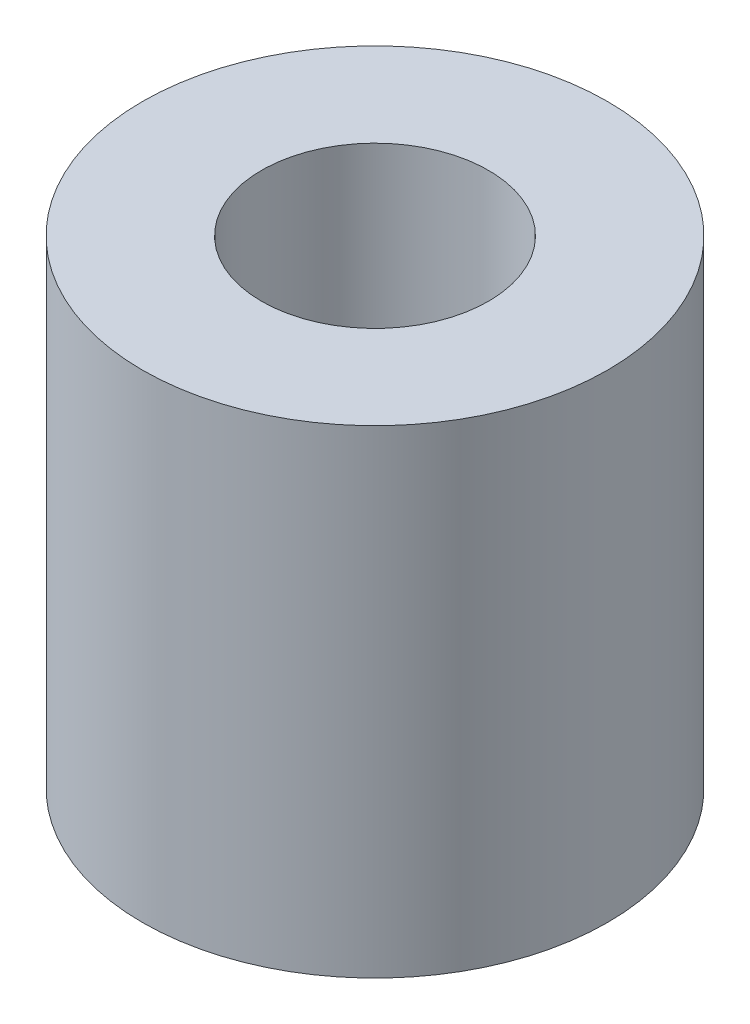
ISO-10303-21;
HEADER;
FILE_DESCRIPTION(('STEP AP214'),'2;1');
FILE_NAME('part.step','',(''),(''),'','','');
FILE_SCHEMA(('AUTOMOTIVE_DESIGN { 1 0 10303 214 1 1 1 1 }'));
ENDSEC;
DATA;
#1=APPLICATION_CONTEXT('core data for automotive mechanical design processes');
#2=APPLICATION_PROTOCOL_DEFINITION('international standard','automotive_design',2000,#1);
#3=PRODUCT_CONTEXT('',#1,'mechanical');
#4=PRODUCT('Part','Part','',(#3));
#5=PRODUCT_RELATED_PRODUCT_CATEGORY('part','',(#4));
#6=PRODUCT_DEFINITION_FORMATION('','',#4);
#7=PRODUCT_DEFINITION_CONTEXT('part definition',#1,'design');
#8=PRODUCT_DEFINITION('design','',#6,#7);
#9=PRODUCT_DEFINITION_SHAPE('','',#8);
#10=(LENGTH_UNIT() NAMED_UNIT(*) SI_UNIT(.MILLI.,.METRE.));
#11=(NAMED_UNIT(*) PLANE_ANGLE_UNIT() SI_UNIT($,.RADIAN.));
#12=(NAMED_UNIT(*) SI_UNIT($,.STERADIAN.) SOLID_ANGLE_UNIT());
#13=UNCERTAINTY_MEASURE_WITH_UNIT(LENGTH_MEASURE(1.E-05),#10,'distance_accuracy_value','');
#14=(GEOMETRIC_REPRESENTATION_CONTEXT(3) GLOBAL_UNCERTAINTY_ASSIGNED_CONTEXT((#13)) GLOBAL_UNIT_ASSIGNED_CONTEXT((#10,
#11,#12)) REPRESENTATION_CONTEXT('',''));
#15=CARTESIAN_POINT('',(0.,0.,0.));
#16=DIRECTION('',(0.,0.,1.));
#17=DIRECTION('',(1.,0.,0.));
#18=AXIS2_PLACEMENT_3D('',#15,#16,#17);
#19=CARTESIAN_POINT('',(0.,25.4,0.));
#20=DIRECTION('',(0.,1.,0.));
#21=DIRECTION('',(0.,0.,1.));
#22=AXIS2_PLACEMENT_3D('',#19,#20,#21);
#23=PLANE('',#22);
#24=CARTESIAN_POINT('',(0.,25.4,0.));
#25=DIRECTION('',(0.,1.,0.));
#26=DIRECTION('',(0.,0.,1.));
#27=AXIS2_PLACEMENT_3D('',#24,#25,#26);
#28=CIRCLE('',#27,12.35);
#29=CARTESIAN_POINT('',(0.,25.4,12.35));
#30=VERTEX_POINT('',#29);
#31=EDGE_CURVE('E10',#30,#30,#28,.T.);
#32=ORIENTED_EDGE('',*,*,#31,.T.);
#33=EDGE_LOOP('',(#32));
#34=FACE_BOUND('',#33,.T.);
#35=CARTESIAN_POINT('',(0.,25.4,0.));
#36=DIRECTION('',(0.,1.,0.));
#37=DIRECTION('',(0.,0.,1.));
#38=AXIS2_PLACEMENT_3D('',#35,#36,#37);
#39=CIRCLE('',#38,6.025);
#40=CARTESIAN_POINT('',(0.,25.4,6.025));
#41=VERTEX_POINT('',#40);
#42=EDGE_CURVE('E56',#41,#41,#39,.T.);
#43=ORIENTED_EDGE('',*,*,#42,.F.);
#44=EDGE_LOOP('',(#43));
#45=FACE_BOUND('',#44,.T.);
#46=ADVANCED_FACE('F43',(#34,#45),#23,.T.);
#47=CARTESIAN_POINT('',(0.,0.,0.));
#48=DIRECTION('',(0.,1.,0.));
#49=DIRECTION('',(0.,0.,1.));
#50=AXIS2_PLACEMENT_3D('',#47,#48,#49);
#51=PLANE('',#50);
#52=CARTESIAN_POINT('',(0.,0.,0.));
#53=DIRECTION('',(0.,1.,0.));
#54=DIRECTION('',(0.,0.,1.));
#55=AXIS2_PLACEMENT_3D('',#52,#53,#54);
#56=CIRCLE('',#55,12.35);
#57=CARTESIAN_POINT('',(0.,0.,12.35));
#58=VERTEX_POINT('',#57);
#59=EDGE_CURVE('E47',#58,#58,#56,.T.);
#60=ORIENTED_EDGE('',*,*,#59,.F.);
#61=EDGE_LOOP('',(#60));
#62=FACE_BOUND('',#61,.T.);
#63=CARTESIAN_POINT('',(0.,0.,0.));
#64=DIRECTION('',(0.,1.,0.));
#65=DIRECTION('',(0.,0.,1.));
#66=AXIS2_PLACEMENT_3D('',#63,#64,#65);
#67=CIRCLE('',#66,6.025);
#68=CARTESIAN_POINT('',(0.,0.,6.025));
#69=VERTEX_POINT('',#68);
#70=EDGE_CURVE('E58',#69,#69,#67,.T.);
#71=ORIENTED_EDGE('',*,*,#70,.T.);
#72=EDGE_LOOP('',(#71));
#73=FACE_BOUND('',#72,.T.);
#74=ADVANCED_FACE('F70',(#62,#73),#51,.F.);
#75=CARTESIAN_POINT('',(0.,25.4,0.));
#76=DIRECTION('',(0.,-1.,0.));
#77=DIRECTION('',(0.,0.,-1.));
#78=AXIS2_PLACEMENT_3D('',#75,#76,#77);
#79=CYLINDRICAL_SURFACE('',#78,12.35);
#80=ORIENTED_EDGE('',*,*,#31,.F.);
#81=EDGE_LOOP('',(#80));
#82=FACE_BOUND('',#81,.T.);
#83=ORIENTED_EDGE('',*,*,#59,.T.);
#84=EDGE_LOOP('',(#83));
#85=FACE_BOUND('',#84,.T.);
#86=ADVANCED_FACE('F45',(#82,#85),#79,.T.);
#87=CARTESIAN_POINT('',(0.,25.4,0.));
#88=DIRECTION('',(0.,-1.,0.));
#89=DIRECTION('',(0.,0.,-1.));
#90=AXIS2_PLACEMENT_3D('',#87,#88,#89);
#91=CYLINDRICAL_SURFACE('',#90,6.025);
#92=ORIENTED_EDGE('',*,*,#42,.T.);
#93=EDGE_LOOP('',(#92));
#94=FACE_BOUND('',#93,.T.);
#95=ORIENTED_EDGE('',*,*,#70,.F.);
#96=EDGE_LOOP('',(#95));
#97=FACE_BOUND('',#96,.T.);
#98=ADVANCED_FACE('F66',(#94,#97),#91,.F.);
#99=CLOSED_SHELL('',(#46,#74,#86,#98));
#100=MANIFOLD_SOLID_BREP('B2',#99);
#101=ADVANCED_BREP_SHAPE_REPRESENTATION('',(#18,#100),#14);
#102=SHAPE_DEFINITION_REPRESENTATION(#9,#101);
ENDSEC;
END-ISO-10303-21;
